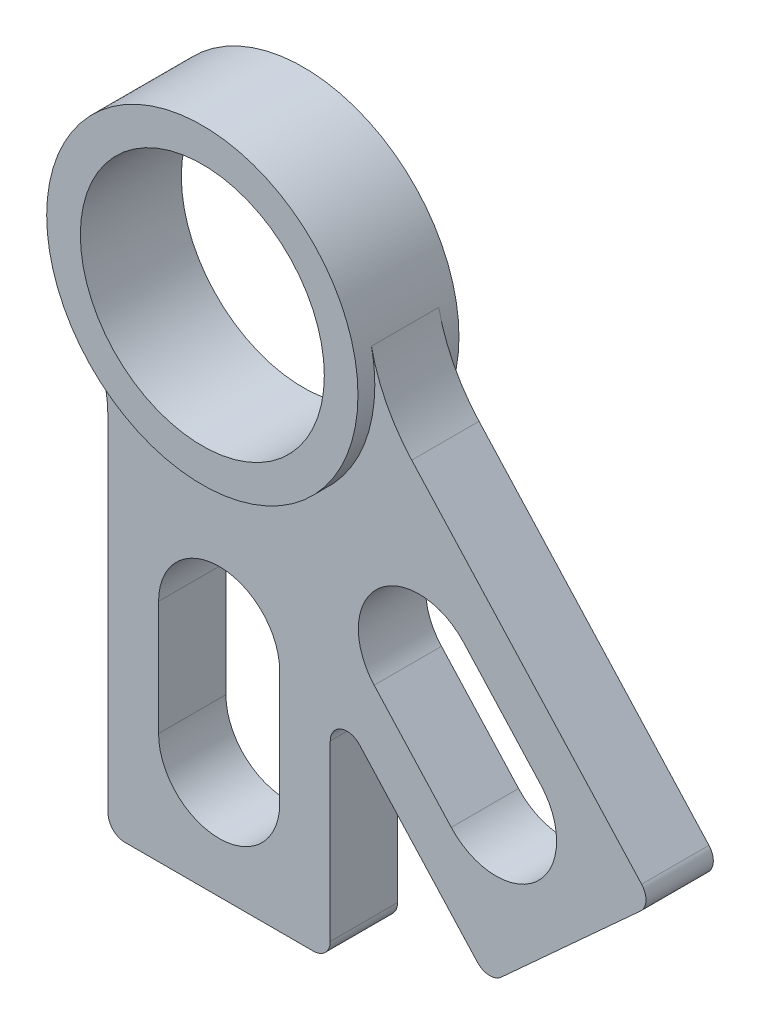
ISO-10303-21;
HEADER;
FILE_DESCRIPTION(('STEP AP214'),'2;1');
FILE_NAME('part.step','',(''),(''),'','','');
FILE_SCHEMA(('AUTOMOTIVE_DESIGN { 1 0 10303 214 1 1 1 1 }'));
ENDSEC;
DATA;
#1=APPLICATION_CONTEXT('core data for automotive mechanical design processes');
#2=APPLICATION_PROTOCOL_DEFINITION('international standard','automotive_design',2000,#1);
#3=PRODUCT_CONTEXT('',#1,'mechanical');
#4=PRODUCT('Part','Part','',(#3));
#5=PRODUCT_RELATED_PRODUCT_CATEGORY('part','',(#4));
#6=PRODUCT_DEFINITION_FORMATION('','',#4);
#7=PRODUCT_DEFINITION_CONTEXT('part definition',#1,'design');
#8=PRODUCT_DEFINITION('design','',#6,#7);
#9=PRODUCT_DEFINITION_SHAPE('','',#8);
#10=(LENGTH_UNIT() NAMED_UNIT(*) SI_UNIT(.MILLI.,.METRE.));
#11=(NAMED_UNIT(*) PLANE_ANGLE_UNIT() SI_UNIT($,.RADIAN.));
#12=(NAMED_UNIT(*) SI_UNIT($,.STERADIAN.) SOLID_ANGLE_UNIT());
#13=UNCERTAINTY_MEASURE_WITH_UNIT(LENGTH_MEASURE(1.E-05),#10,'distance_accuracy_value','');
#14=(GEOMETRIC_REPRESENTATION_CONTEXT(3) GLOBAL_UNCERTAINTY_ASSIGNED_CONTEXT((#13)) GLOBAL_UNIT_ASSIGNED_CONTEXT((#10,
#11,#12)) REPRESENTATION_CONTEXT('',''));
#15=CARTESIAN_POINT('',(0.,0.,0.));
#16=DIRECTION('',(0.,0.,1.));
#17=DIRECTION('',(1.,0.,0.));
#18=AXIS2_PLACEMENT_3D('',#15,#16,#17);
#19=CARTESIAN_POINT('',(0.,-27.8494680994688,4.7625));
#20=DIRECTION('',(0.,0.,-1.));
#21=DIRECTION('',(-1.,0.,0.));
#22=AXIS2_PLACEMENT_3D('',#19,#20,#21);
#23=CYLINDRICAL_SURFACE('',#22,5.71499999999999);
#24=CARTESIAN_POINT('',(0.,-27.8494680994688,-3.175));
#25=DIRECTION('',(0.,0.,1.));
#26=DIRECTION('',(1.,0.,0.));
#27=AXIS2_PLACEMENT_3D('',#24,#25,#26);
#28=CIRCLE('',#27,5.71500000000001);
#29=CARTESIAN_POINT('',(5.71500000000001,-27.8494680994688,-3.175));
#30=VERTEX_POINT('',#29);
#31=CARTESIAN_POINT('',(-5.71499999999999,-27.8494680994688,-3.175));
#32=VERTEX_POINT('',#31);
#33=EDGE_CURVE('E504',#30,#32,#28,.T.);
#34=ORIENTED_EDGE('',*,*,#33,.F.);
#35=DIRECTION('',(0.,0.,-1.));
#36=VECTOR('',#35,1.);
#37=CARTESIAN_POINT('',(5.71499999999999,-27.8494680994688,4.7625));
#38=LINE('',#37,#36);
#39=CARTESIAN_POINT('',(5.71500000000001,-27.8494680994688,3.175));
#40=VERTEX_POINT('',#39);
#41=EDGE_CURVE('E391',#40,#30,#38,.T.);
#42=ORIENTED_EDGE('',*,*,#41,.F.);
#43=CARTESIAN_POINT('',(0.,-27.8494680994688,3.175));
#44=DIRECTION('',(0.,0.,1.));
#45=DIRECTION('',(1.,0.,0.));
#46=AXIS2_PLACEMENT_3D('',#43,#44,#45);
#47=CIRCLE('',#46,5.71500000000001);
#48=CARTESIAN_POINT('',(-5.71500000000001,-27.8494680994688,3.175));
#49=VERTEX_POINT('',#48);
#50=EDGE_CURVE('E539',#40,#49,#47,.T.);
#51=ORIENTED_EDGE('',*,*,#50,.T.);
#52=DIRECTION('',(0.,0.,-1.));
#53=VECTOR('',#52,1.);
#54=CARTESIAN_POINT('',(-5.71499999999999,-27.8494680994688,4.7625));
#55=LINE('',#54,#53);
#56=EDGE_CURVE('E368',#49,#32,#55,.T.);
#57=ORIENTED_EDGE('',*,*,#56,.T.);
#58=EDGE_LOOP('',(#34,#42,#51,#57));
#59=FACE_BOUND('',#58,.T.);
#60=ADVANCED_FACE('F191',(#59),#23,.F.);
#61=CARTESIAN_POINT('',(5.71499999999995,0.,4.7625));
#62=DIRECTION('',(-1.,0.,0.));
#63=DIRECTION('',(0.,-1.,0.));
#64=AXIS2_PLACEMENT_3D('',#61,#62,#63);
#65=PLANE('',#64);
#66=DIRECTION('',(0.,1.,0.));
#67=VECTOR('',#66,1.);
#68=CARTESIAN_POINT('',(5.71500000000003,0.,-3.175));
#69=LINE('',#68,#67);
#70=CARTESIAN_POINT('',(5.715,-38.6444680994688,-3.175));
#71=VERTEX_POINT('',#70);
#72=EDGE_CURVE('E506',#71,#30,#69,.T.);
#73=ORIENTED_EDGE('',*,*,#72,.F.);
#74=DIRECTION('',(0.,0.,-1.));
#75=VECTOR('',#74,1.);
#76=CARTESIAN_POINT('',(5.715,-38.6444680994688,4.7625));
#77=LINE('',#76,#75);
#78=CARTESIAN_POINT('',(5.715,-38.6444680994688,3.175));
#79=VERTEX_POINT('',#78);
#80=EDGE_CURVE('E485',#79,#71,#77,.T.);
#81=ORIENTED_EDGE('',*,*,#80,.F.);
#82=DIRECTION('',(0.,-1.,0.));
#83=VECTOR('',#82,1.);
#84=CARTESIAN_POINT('',(5.71500000000003,0.,3.175));
#85=LINE('',#84,#83);
#86=EDGE_CURVE('E537',#40,#79,#85,.T.);
#87=ORIENTED_EDGE('',*,*,#86,.F.);
#88=ORIENTED_EDGE('',*,*,#41,.T.);
#89=EDGE_LOOP('',(#73,#81,#87,#88));
#90=FACE_BOUND('',#89,.T.);
#91=ADVANCED_FACE('F577',(#90),#65,.T.);
#92=CARTESIAN_POINT('',(0.,-38.6444680994688,4.7625));
#93=DIRECTION('',(0.,0.,-1.));
#94=DIRECTION('',(-1.,0.,0.));
#95=AXIS2_PLACEMENT_3D('',#92,#93,#94);
#96=CYLINDRICAL_SURFACE('',#95,5.715);
#97=CARTESIAN_POINT('',(0.,-38.6444680994688,-3.175));
#98=DIRECTION('',(0.,0.,1.));
#99=DIRECTION('',(1.,0.,0.));
#100=AXIS2_PLACEMENT_3D('',#97,#98,#99);
#101=CIRCLE('',#100,5.715);
#102=CARTESIAN_POINT('',(-5.71500000000001,-38.6444680994688,-3.175));
#103=VERTEX_POINT('',#102);
#104=EDGE_CURVE('E508',#103,#71,#101,.T.);
#105=ORIENTED_EDGE('',*,*,#104,.F.);
#106=DIRECTION('',(0.,0.,-1.));
#107=VECTOR('',#106,1.);
#108=CARTESIAN_POINT('',(-5.715,-38.6444680994688,4.7625));
#109=LINE('',#108,#107);
#110=CARTESIAN_POINT('',(-5.715,-38.6444680994688,3.175));
#111=VERTEX_POINT('',#110);
#112=EDGE_CURVE('E482',#111,#103,#109,.T.);
#113=ORIENTED_EDGE('',*,*,#112,.F.);
#114=CARTESIAN_POINT('',(0.,-38.6444680994688,3.175));
#115=DIRECTION('',(0.,0.,1.));
#116=DIRECTION('',(1.,0.,0.));
#117=AXIS2_PLACEMENT_3D('',#114,#115,#116);
#118=CIRCLE('',#117,5.715);
#119=EDGE_CURVE('E534',#111,#79,#118,.T.);
#120=ORIENTED_EDGE('',*,*,#119,.T.);
#121=ORIENTED_EDGE('',*,*,#80,.T.);
#122=EDGE_LOOP('',(#105,#113,#120,#121));
#123=FACE_BOUND('',#122,.T.);
#124=ADVANCED_FACE('F583',(#123),#96,.F.);
#125=CARTESIAN_POINT('',(18.8429544518519,-20.6791159106485,4.7625));
#126=DIRECTION('',(0.,0.,-1.));
#127=DIRECTION('',(-1.,0.,0.));
#128=AXIS2_PLACEMENT_3D('',#125,#126,#127);
#129=CYLINDRICAL_SURFACE('',#128,5.71500000000001);
#130=CARTESIAN_POINT('',(18.8429544518522,-20.6791159106487,-3.175));
#131=DIRECTION('',(0.,0.,1.));
#132=DIRECTION('',(1.,0.,0.));
#133=AXIS2_PLACEMENT_3D('',#130,#131,#132);
#134=CIRCLE('',#133,5.71500000000001);
#135=CARTESIAN_POINT('',(23.0672599291972,-16.8298993365816,-3.175));
#136=VERTEX_POINT('',#135);
#137=CARTESIAN_POINT('',(14.6186489745069,-24.5283324847155,-3.175));
#138=VERTEX_POINT('',#137);
#139=EDGE_CURVE('E361',#136,#138,#134,.T.);
#140=ORIENTED_EDGE('',*,*,#139,.F.);
#141=DIRECTION('',(0.,0.,-1.));
#142=VECTOR('',#141,1.);
#143=CARTESIAN_POINT('',(23.0672599291971,-16.8298993365813,4.7625));
#144=LINE('',#143,#142);
#145=CARTESIAN_POINT('',(23.0672599291972,-16.8298993365816,3.175));
#146=VERTEX_POINT('',#145);
#147=EDGE_CURVE('E360',#146,#136,#144,.T.);
#148=ORIENTED_EDGE('',*,*,#147,.F.);
#149=CARTESIAN_POINT('',(18.8429544518522,-20.6791159106487,3.175));
#150=DIRECTION('',(0.,0.,1.));
#151=DIRECTION('',(1.,0.,0.));
#152=AXIS2_PLACEMENT_3D('',#149,#150,#151);
#153=CIRCLE('',#152,5.71500000000001);
#154=CARTESIAN_POINT('',(14.6186489745071,-24.5283324847157,3.175));
#155=VERTEX_POINT('',#154);
#156=EDGE_CURVE('E494',#146,#155,#153,.T.);
#157=ORIENTED_EDGE('',*,*,#156,.T.);
#158=DIRECTION('',(0.,0.,-1.));
#159=VECTOR('',#158,1.);
#160=CARTESIAN_POINT('',(14.6186489745069,-24.5283324847155,4.7625));
#161=LINE('',#160,#159);
#162=EDGE_CURVE('E370',#155,#138,#161,.T.);
#163=ORIENTED_EDGE('',*,*,#162,.T.);
#164=EDGE_LOOP('',(#140,#148,#157,#163));
#165=FACE_BOUND('',#164,.T.);
#166=ADVANCED_FACE('F493',(#165),#129,.F.);
#167=CARTESIAN_POINT('',(4.22430547734509,3.84921657406708,4.7625));
#168=DIRECTION('',(-0.73916106340246,-0.673528709373063,0.));
#169=DIRECTION('',(0.673528709373063,-0.73916106340246,0.));
#170=AXIS2_PLACEMENT_3D('',#167,#168,#169);
#171=PLANE('',#170);
#172=DIRECTION('',(-0.673528709373063,0.73916106340246,0.));
#173=VECTOR('',#172,1.);
#174=CARTESIAN_POINT('',(4.22430547734507,3.84921657406706,-3.175));
#175=LINE('',#174,#173);
#176=CARTESIAN_POINT('',(30.3380023468795,-24.8091430160112,-3.175));
#177=VERTEX_POINT('',#176);
#178=EDGE_CURVE('E343',#177,#136,#175,.T.);
#179=ORIENTED_EDGE('',*,*,#178,.F.);
#180=DIRECTION('',(0.,0.,-1.));
#181=VECTOR('',#180,1.);
#182=CARTESIAN_POINT('',(30.3380023468793,-24.8091430160109,4.7625));
#183=LINE('',#182,#181);
#184=CARTESIAN_POINT('',(30.3380023468795,-24.8091430160112,3.175));
#185=VERTEX_POINT('',#184);
#186=EDGE_CURVE('E358',#185,#177,#183,.T.);
#187=ORIENTED_EDGE('',*,*,#186,.F.);
#188=DIRECTION('',(0.673528709373063,-0.73916106340246,0.));
#189=VECTOR('',#188,1.);
#190=CARTESIAN_POINT('',(4.22430547734507,3.84921657406706,3.175));
#191=LINE('',#190,#189);
#192=EDGE_CURVE('E530',#146,#185,#191,.T.);
#193=ORIENTED_EDGE('',*,*,#192,.F.);
#194=ORIENTED_EDGE('',*,*,#147,.T.);
#195=EDGE_LOOP('',(#179,#187,#193,#194));
#196=FACE_BOUND('',#195,.T.);
#197=ADVANCED_FACE('F356',(#196),#171,.T.);
#198=CARTESIAN_POINT('',(26.1136968695342,-28.658359590078,4.7625));
#199=DIRECTION('',(0.,0.,-1.));
#200=DIRECTION('',(-1.,0.,0.));
#201=AXIS2_PLACEMENT_3D('',#198,#199,#200);
#202=CYLINDRICAL_SURFACE('',#201,5.71500000000002);
#203=CARTESIAN_POINT('',(26.1136968695344,-28.6583595900782,-3.175));
#204=DIRECTION('',(0.,0.,1.));
#205=DIRECTION('',(1.,0.,0.));
#206=AXIS2_PLACEMENT_3D('',#203,#204,#205);
#207=CIRCLE('',#206,5.71500000000001);
#208=CARTESIAN_POINT('',(21.8893913921893,-32.5075761641453,-3.175));
#209=VERTEX_POINT('',#208);
#210=EDGE_CURVE('E339',#209,#177,#207,.T.);
#211=ORIENTED_EDGE('',*,*,#210,.F.);
#212=DIRECTION('',(0.,0.,-1.));
#213=VECTOR('',#212,1.);
#214=CARTESIAN_POINT('',(21.8893913921891,-32.5075761641451,4.7625));
#215=LINE('',#214,#213);
#216=CARTESIAN_POINT('',(21.8893913921891,-32.5075761641451,3.175));
#217=VERTEX_POINT('',#216);
#218=EDGE_CURVE('E366',#217,#209,#215,.T.);
#219=ORIENTED_EDGE('',*,*,#218,.F.);
#220=CARTESIAN_POINT('',(26.1136968695344,-28.6583595900782,3.175));
#221=DIRECTION('',(0.,0.,1.));
#222=DIRECTION('',(1.,0.,0.));
#223=AXIS2_PLACEMENT_3D('',#220,#221,#222);
#224=CIRCLE('',#223,5.71500000000001);
#225=EDGE_CURVE('E365',#217,#185,#224,.T.);
#226=ORIENTED_EDGE('',*,*,#225,.T.);
#227=ORIENTED_EDGE('',*,*,#186,.T.);
#228=EDGE_LOOP('',(#211,#219,#226,#227));
#229=FACE_BOUND('',#228,.T.);
#230=ADVANCED_FACE('F364',(#229),#202,.F.);
#231=CARTESIAN_POINT('',(29.8961889852618,6.31658472573722,4.7625));
#232=DIRECTION('',(0.,0.,-1.));
#233=DIRECTION('',(-1.,0.,0.));
#234=AXIS2_PLACEMENT_3D('',#231,#232,#233);
#235=CYLINDRICAL_SURFACE('',#234,15.8749999999984);
#236=DIRECTION('',(0.,0.,-1.));
#237=VECTOR('',#236,1.);
#238=CARTESIAN_POINT('',(18.1620071037492,-4.37568353555936,4.7625));
#239=LINE('',#238,#237);
#240=CARTESIAN_POINT('',(18.1620071037489,-4.37568353555901,3.175));
#241=VERTEX_POINT('',#240);
#242=CARTESIAN_POINT('',(18.1620071037488,-4.375683535559,-3.175));
#243=VERTEX_POINT('',#242);
#244=EDGE_CURVE('E374',#241,#243,#239,.T.);
#245=ORIENTED_EDGE('',*,*,#244,.T.);
#246=CARTESIAN_POINT('',(29.8961889852617,6.31658472573731,-3.175));
#247=DIRECTION('',(0.,0.,1.));
#248=DIRECTION('',(1.,0.,0.));
#249=AXIS2_PLACEMENT_3D('',#246,#247,#248);
#250=CIRCLE('',#249,15.8749999999984);
#251=CARTESIAN_POINT('',(14.3640874758788,3.03490105692132,-3.175));
#252=VERTEX_POINT('',#251);
#253=EDGE_CURVE('E512',#252,#243,#250,.T.);
#254=ORIENTED_EDGE('',*,*,#253,.F.);
#255=DIRECTION('',(0.,0.,-1.));
#256=VECTOR('',#255,1.);
#257=CARTESIAN_POINT('',(14.3640874758788,3.03490105692129,4.7625));
#258=LINE('',#257,#256);
#259=CARTESIAN_POINT('',(14.3640874758788,3.03490105692132,3.175));
#260=VERTEX_POINT('',#259);
#261=EDGE_CURVE('E384',#260,#252,#258,.T.);
#262=ORIENTED_EDGE('',*,*,#261,.F.);
#263=CARTESIAN_POINT('',(29.8961889852617,6.31658472573731,3.175));
#264=DIRECTION('',(0.,0.,1.));
#265=DIRECTION('',(1.,0.,0.));
#266=AXIS2_PLACEMENT_3D('',#263,#264,#265);
#267=CIRCLE('',#266,15.8749999999984);
#268=EDGE_CURVE('E466',#260,#241,#267,.T.);
#269=ORIENTED_EDGE('',*,*,#268,.T.);
#270=EDGE_LOOP('',(#245,#254,#262,#269));
#271=FACE_BOUND('',#270,.T.);
#272=ADVANCED_FACE('F594',(#271),#235,.F.);
#273=CARTESIAN_POINT('',(-26.3524999999984,-15.4669680994688,4.7625));
#274=DIRECTION('',(0.,0.,-1.));
#275=DIRECTION('',(-1.,0.,0.));
#276=AXIS2_PLACEMENT_3D('',#273,#274,#275);
#277=CYLINDRICAL_SURFACE('',#276,15.8749999999984);
#278=CARTESIAN_POINT('',(-26.3524999999984,-15.4669680994688,-3.175));
#279=DIRECTION('',(0.,0.,1.));
#280=DIRECTION('',(1.,0.,0.));
#281=AXIS2_PLACEMENT_3D('',#278,#279,#280);
#282=CIRCLE('',#281,15.8749999999984);
#283=CARTESIAN_POINT('',(-10.4775,-15.4669680994688,-3.175));
#284=VERTEX_POINT('',#283);
#285=CARTESIAN_POINT('',(-12.6614671654197,-7.43134460639522,-3.175));
#286=VERTEX_POINT('',#285);
#287=EDGE_CURVE('E517',#284,#286,#282,.T.);
#288=ORIENTED_EDGE('',*,*,#287,.F.);
#289=DIRECTION('',(0.,0.,-1.));
#290=VECTOR('',#289,1.);
#291=CARTESIAN_POINT('',(-10.4775,-15.4669680994688,4.7625));
#292=LINE('',#291,#290);
#293=CARTESIAN_POINT('',(-10.4775,-15.4669680994688,3.175));
#294=VERTEX_POINT('',#293);
#295=EDGE_CURVE('E377',#294,#284,#292,.T.);
#296=ORIENTED_EDGE('',*,*,#295,.F.);
#297=CARTESIAN_POINT('',(-26.3524999999984,-15.4669680994688,3.175));
#298=DIRECTION('',(0.,0.,1.));
#299=DIRECTION('',(1.,0.,0.));
#300=AXIS2_PLACEMENT_3D('',#297,#298,#299);
#301=CIRCLE('',#300,15.8749999999984);
#302=CARTESIAN_POINT('',(-12.6614671654197,-7.43134460639522,3.175));
#303=VERTEX_POINT('',#302);
#304=EDGE_CURVE('E461',#294,#303,#301,.T.);
#305=ORIENTED_EDGE('',*,*,#304,.T.);
#306=DIRECTION('',(0.,0.,-1.));
#307=VECTOR('',#306,1.);
#308=CARTESIAN_POINT('',(-12.6614671654197,-7.43134460639522,4.7625));
#309=LINE('',#308,#307);
#310=EDGE_CURVE('E381',#303,#286,#309,.T.);
#311=ORIENTED_EDGE('',*,*,#310,.T.);
#312=EDGE_LOOP('',(#288,#296,#305,#311));
#313=FACE_BOUND('',#312,.T.);
#314=ADVANCED_FACE('F615',(#313),#277,.F.);
#315=CARTESIAN_POINT('',(-10.4775,0.,4.7625));
#316=DIRECTION('',(1.,0.,0.));
#317=DIRECTION('',(0.,0.,-1.));
#318=AXIS2_PLACEMENT_3D('',#315,#316,#317);
#319=PLANE('',#318);
#320=DIRECTION('',(0.,-1.,0.));
#321=VECTOR('',#320,1.);
#322=CARTESIAN_POINT('',(-10.4775,0.,-3.175));
#323=LINE('',#322,#321);
#324=CARTESIAN_POINT('',(-10.4775,-47.5344680994688,-3.175));
#325=VERTEX_POINT('',#324);
#326=EDGE_CURVE('E520',#284,#325,#323,.T.);
#327=ORIENTED_EDGE('',*,*,#326,.T.);
#328=DIRECTION('',(0.,0.,-1.));
#329=VECTOR('',#328,1.);
#330=CARTESIAN_POINT('',(-10.4775,-47.5344680994688,4.7625));
#331=LINE('',#330,#329);
#332=CARTESIAN_POINT('',(-10.4775,-47.5344680994688,3.175));
#333=VERTEX_POINT('',#332);
#334=EDGE_CURVE('E426',#325,#333,#331,.F.);
#335=ORIENTED_EDGE('',*,*,#334,.T.);
#336=DIRECTION('',(0.,1.,0.));
#337=VECTOR('',#336,1.);
#338=CARTESIAN_POINT('',(-10.4775,0.,3.175));
#339=LINE('',#338,#337);
#340=EDGE_CURVE('E459',#333,#294,#339,.T.);
#341=ORIENTED_EDGE('',*,*,#340,.T.);
#342=ORIENTED_EDGE('',*,*,#295,.T.);
#343=EDGE_LOOP('',(#327,#335,#341,#342));
#344=FACE_BOUND('',#343,.T.);
#345=ADVANCED_FACE('F611',(#344),#319,.F.);
#346=CARTESIAN_POINT('',(0.,-49.1219680994688,4.7625));
#347=DIRECTION('',(0.,1.,0.));
#348=DIRECTION('',(-1.,0.,0.));
#349=AXIS2_PLACEMENT_3D('',#346,#347,#348);
#350=PLANE('',#349);
#351=DIRECTION('',(1.,0.,0.));
#352=VECTOR('',#351,1.);
#353=CARTESIAN_POINT('',(0.,-49.1219680994688,-3.175));
#354=LINE('',#353,#352);
#355=CARTESIAN_POINT('',(-8.89,-49.1219680994688,-3.175));
#356=VERTEX_POINT('',#355);
#357=CARTESIAN_POINT('',(8.89,-49.1219680994688,-3.175));
#358=VERTEX_POINT('',#357);
#359=EDGE_CURVE('E441',#356,#358,#354,.T.);
#360=ORIENTED_EDGE('',*,*,#359,.T.);
#361=DIRECTION('',(0.,0.,-1.));
#362=VECTOR('',#361,1.);
#363=CARTESIAN_POINT('',(8.89,-49.1219680994688,3.175));
#364=LINE('',#363,#362);
#365=CARTESIAN_POINT('',(8.89,-49.1219680994688,3.175));
#366=VERTEX_POINT('',#365);
#367=EDGE_CURVE('E424',#358,#366,#364,.F.);
#368=ORIENTED_EDGE('',*,*,#367,.T.);
#369=DIRECTION('',(-1.,0.,0.));
#370=VECTOR('',#369,1.);
#371=CARTESIAN_POINT('',(0.,-49.1219680994688,3.175));
#372=LINE('',#371,#370);
#373=CARTESIAN_POINT('',(-8.89,-49.1219680994688,3.175));
#374=VERTEX_POINT('',#373);
#375=EDGE_CURVE('E450',#366,#374,#372,.T.);
#376=ORIENTED_EDGE('',*,*,#375,.T.);
#377=DIRECTION('',(0.,0.,-1.));
#378=VECTOR('',#377,1.);
#379=CARTESIAN_POINT('',(-8.89,-49.1219680994688,4.7625));
#380=LINE('',#379,#378);
#381=EDGE_CURVE('E421',#374,#356,#380,.T.);
#382=ORIENTED_EDGE('',*,*,#381,.T.);
#383=EDGE_LOOP('',(#360,#368,#376,#382));
#384=FACE_BOUND('',#383,.T.);
#385=ADVANCED_FACE('F608',(#384),#350,.F.);
#386=CARTESIAN_POINT('',(10.4775,0.,4.7625));
#387=DIRECTION('',(1.,0.,0.));
#388=DIRECTION('',(0.,1.,0.));
#389=AXIS2_PLACEMENT_3D('',#386,#387,#388);
#390=PLANE('',#389);
#391=DIRECTION('',(0.,-1.,0.));
#392=VECTOR('',#391,1.);
#393=CARTESIAN_POINT('',(10.4775,0.,-3.175));
#394=LINE('',#393,#392);
#395=CARTESIAN_POINT('',(10.4775,-31.1537992931023,-3.175));
#396=VERTEX_POINT('',#395);
#397=CARTESIAN_POINT('',(10.4775,-47.5344680994688,-3.175));
#398=VERTEX_POINT('',#397);
#399=EDGE_CURVE('E432',#396,#398,#394,.T.);
#400=ORIENTED_EDGE('',*,*,#399,.F.);
#401=DIRECTION('',(0.,0.,-1.));
#402=VECTOR('',#401,1.);
#403=CARTESIAN_POINT('',(10.4775,-31.1537992931023,3.175));
#404=LINE('',#403,#402);
#405=CARTESIAN_POINT('',(10.4775,-31.1537992931023,3.175));
#406=VERTEX_POINT('',#405);
#407=EDGE_CURVE('E419',#396,#406,#404,.F.);
#408=ORIENTED_EDGE('',*,*,#407,.T.);
#409=DIRECTION('',(0.,1.,0.));
#410=VECTOR('',#409,1.);
#411=CARTESIAN_POINT('',(10.4775,0.,3.175));
#412=LINE('',#411,#410);
#413=CARTESIAN_POINT('',(10.4775,-47.5344680994688,3.175));
#414=VERTEX_POINT('',#413);
#415=EDGE_CURVE('E447',#414,#406,#412,.T.);
#416=ORIENTED_EDGE('',*,*,#415,.F.);
#417=DIRECTION('',(0.,0.,-1.));
#418=VECTOR('',#417,1.);
#419=CARTESIAN_POINT('',(10.4775,-47.5344680994688,-3.175));
#420=LINE('',#419,#418);
#421=EDGE_CURVE('E416',#414,#398,#420,.T.);
#422=ORIENTED_EDGE('',*,*,#421,.T.);
#423=EDGE_LOOP('',(#400,#408,#416,#422));
#424=FACE_BOUND('',#423,.T.);
#425=ADVANCED_FACE('F438',(#424),#390,.T.);
#426=CARTESIAN_POINT('',(-7.74456004179922,-7.05689705245619,4.7625));
#427=DIRECTION('',(-0.739161063402461,-0.673528709373062,0.));
#428=DIRECTION('',(0.673528709373062,-0.739161063402461,0.));
#429=AXIS2_PLACEMENT_3D('',#426,#427,#428);
#430=PLANE('',#429);
#431=DIRECTION('',(-0.673528709373064,0.73916106340246,0.));
#432=VECTOR('',#431,1.);
#433=CARTESIAN_POINT('',(-7.74456004179929,-7.05689705245629,-3.175));
#434=LINE('',#433,#432);
#435=CARTESIAN_POINT('',(24.3568070540614,-42.2863984961821,-3.175));
#436=VERTEX_POINT('',#435);
#437=CARTESIAN_POINT('',(13.2384181881514,-30.0845724669726,-3.175));
#438=VERTEX_POINT('',#437);
#439=EDGE_CURVE('E433',#436,#438,#434,.T.);
#440=ORIENTED_EDGE('',*,*,#439,.F.);
#441=DIRECTION('',(0.,0.,-1.));
#442=VECTOR('',#441,1.);
#443=CARTESIAN_POINT('',(24.3568070540614,-42.2863984961821,3.175));
#444=LINE('',#443,#442);
#445=CARTESIAN_POINT('',(24.3568070540614,-42.2863984961821,3.175));
#446=VERTEX_POINT('',#445);
#447=EDGE_CURVE('E206',#436,#446,#444,.F.);
#448=ORIENTED_EDGE('',*,*,#447,.T.);
#449=DIRECTION('',(0.673528709373064,-0.73916106340246,0.));
#450=VECTOR('',#449,1.);
#451=CARTESIAN_POINT('',(-7.74456004179929,-7.05689705245629,3.175));
#452=LINE('',#451,#450);
#453=CARTESIAN_POINT('',(13.2384181881514,-30.0845724669726,3.175));
#454=VERTEX_POINT('',#453);
#455=EDGE_CURVE('E445',#454,#446,#452,.T.);
#456=ORIENTED_EDGE('',*,*,#455,.F.);
#457=DIRECTION('',(0.,0.,-1.));
#458=VECTOR('',#457,1.);
#459=CARTESIAN_POINT('',(13.2384181881514,-30.0845724669726,-3.175));
#460=LINE('',#459,#458);
#461=EDGE_CURVE('E412',#454,#438,#460,.T.);
#462=ORIENTED_EDGE('',*,*,#461,.T.);
#463=EDGE_LOOP('',(#440,#448,#456,#462));
#464=FACE_BOUND('',#463,.T.);
#465=ADVANCED_FACE('F444',(#464),#430,.T.);
#466=CARTESIAN_POINT('',(33.1705939219905,-36.4029196318772,4.7625));
#467=DIRECTION('',(-0.673528709373065,0.739161063402459,0.));
#468=DIRECTION('',(-0.739161063402459,-0.673528709373065,0.));
#469=AXIS2_PLACEMENT_3D('',#466,#467,#468);
#470=PLANE('',#469);
#471=DIRECTION('',(0.739161063402461,0.673528709373063,0.));
#472=VECTOR('',#471,1.);
#473=CARTESIAN_POINT('',(33.1705939219906,-36.4029196318775,-3.175));
#474=LINE('',#473,#472);
#475=CARTESIAN_POINT('',(26.5994520683428,-42.390589858204,-3.175));
#476=VERTEX_POINT('',#475);
#477=CARTESIAN_POINT('',(39.7417357756385,-30.415249405551,-3.175));
#478=VERTEX_POINT('',#477);
#479=EDGE_CURVE('E526',#476,#478,#474,.T.);
#480=ORIENTED_EDGE('',*,*,#479,.T.);
#481=DIRECTION('',(0.,0.,-1.));
#482=VECTOR('',#481,1.);
#483=CARTESIAN_POINT('',(39.7417357756383,-30.4152494055507,4.7625));
#484=LINE('',#483,#482);
#485=CARTESIAN_POINT('',(39.7417357756385,-30.415249405551,3.175));
#486=VERTEX_POINT('',#485);
#487=EDGE_CURVE('E402',#478,#486,#484,.F.);
#488=ORIENTED_EDGE('',*,*,#487,.T.);
#489=DIRECTION('',(-0.739161063402461,-0.673528709373063,0.));
#490=VECTOR('',#489,1.);
#491=CARTESIAN_POINT('',(33.1705939219906,-36.4029196318775,3.175));
#492=LINE('',#491,#490);
#493=CARTESIAN_POINT('',(26.5994520683428,-42.390589858204,3.175));
#494=VERTEX_POINT('',#493);
#495=EDGE_CURVE('E448',#486,#494,#492,.T.);
#496=ORIENTED_EDGE('',*,*,#495,.T.);
#497=DIRECTION('',(0.,0.,-1.));
#498=VECTOR('',#497,1.);
#499=CARTESIAN_POINT('',(26.5994520683426,-42.3905898582038,-3.175));
#500=LINE('',#499,#498);
#501=EDGE_CURVE('E399',#494,#476,#500,.T.);
#502=ORIENTED_EDGE('',*,*,#501,.T.);
#503=EDGE_LOOP('',(#480,#488,#496,#502));
#504=FACE_BOUND('',#503,.T.);
#505=ADVANCED_FACE('F556',(#504),#470,.F.);
#506=CARTESIAN_POINT('',(-5.71499999999995,0.,4.7625));
#507=DIRECTION('',(-1.,0.,0.));
#508=DIRECTION('',(0.,-1.,0.));
#509=AXIS2_PLACEMENT_3D('',#506,#507,#508);
#510=PLANE('',#509);
#511=ORIENTED_EDGE('',*,*,#112,.T.);
#512=DIRECTION('',(0.,1.,0.));
#513=VECTOR('',#512,1.);
#514=CARTESIAN_POINT('',(-5.71500000000003,0.,-3.175));
#515=LINE('',#514,#513);
#516=EDGE_CURVE('E351',#103,#32,#515,.T.);
#517=ORIENTED_EDGE('',*,*,#516,.T.);
#518=ORIENTED_EDGE('',*,*,#56,.F.);
#519=DIRECTION('',(0.,-1.,0.));
#520=VECTOR('',#519,1.);
#521=CARTESIAN_POINT('',(-5.71500000000003,0.,3.175));
#522=LINE('',#521,#520);
#523=EDGE_CURVE('E542',#49,#111,#522,.T.);
#524=ORIENTED_EDGE('',*,*,#523,.T.);
#525=EDGE_LOOP('',(#511,#517,#518,#524));
#526=FACE_BOUND('',#525,.T.);
#527=ADVANCED_FACE('F591',(#526),#510,.F.);
#528=CARTESIAN_POINT('',(-4.22430547734502,-3.84921657406701,4.7625));
#529=DIRECTION('',(-0.739161063402461,-0.673528709373062,0.));
#530=DIRECTION('',(0.673528709373062,-0.739161063402461,0.));
#531=AXIS2_PLACEMENT_3D('',#528,#529,#530);
#532=PLANE('',#531);
#533=ORIENTED_EDGE('',*,*,#218,.T.);
#534=DIRECTION('',(-0.673528709373064,0.73916106340246,0.));
#535=VECTOR('',#534,1.);
#536=CARTESIAN_POINT('',(-4.22430547734507,-3.84921657406707,-3.175));
#537=LINE('',#536,#535);
#538=EDGE_CURVE('E346',#209,#138,#537,.T.);
#539=ORIENTED_EDGE('',*,*,#538,.T.);
#540=ORIENTED_EDGE('',*,*,#162,.F.);
#541=DIRECTION('',(0.673528709373064,-0.73916106340246,0.));
#542=VECTOR('',#541,1.);
#543=CARTESIAN_POINT('',(-4.22430547734507,-3.84921657406707,3.175));
#544=LINE('',#543,#542);
#545=EDGE_CURVE('E498',#155,#217,#544,.T.);
#546=ORIENTED_EDGE('',*,*,#545,.T.);
#547=EDGE_LOOP('',(#533,#539,#540,#546));
#548=FACE_BOUND('',#547,.T.);
#549=ADVANCED_FACE('F497',(#548),#532,.F.);
#550=CARTESIAN_POINT('',(7.74456004179932,7.0568970524563,4.7625));
#551=DIRECTION('',(-0.739161063402461,-0.673528709373062,0.));
#552=DIRECTION('',(0.673528709373062,-0.739161063402461,0.));
#553=AXIS2_PLACEMENT_3D('',#550,#551,#552);
#554=PLANE('',#553);
#555=DIRECTION('',(0.673528709373063,-0.739161063402461,0.));
#556=VECTOR('',#555,1.);
#557=CARTESIAN_POINT('',(7.7445600417993,7.05689705245628,3.175));
#558=LINE('',#557,#556);
#559=CARTESIAN_POINT('',(39.84592713766,-28.1726043912696,3.175));
#560=VERTEX_POINT('',#559);
#561=EDGE_CURVE('E453',#241,#560,#558,.T.);
#562=ORIENTED_EDGE('',*,*,#561,.T.);
#563=DIRECTION('',(0.,0.,-1.));
#564=VECTOR('',#563,1.);
#565=CARTESIAN_POINT('',(39.84592713766,-28.1726043912696,4.7625));
#566=LINE('',#565,#564);
#567=CARTESIAN_POINT('',(39.84592713766,-28.1726043912696,-3.175));
#568=VERTEX_POINT('',#567);
#569=EDGE_CURVE('E387',#560,#568,#566,.T.);
#570=ORIENTED_EDGE('',*,*,#569,.T.);
#571=DIRECTION('',(-0.673528709373063,0.739161063402461,0.));
#572=VECTOR('',#571,1.);
#573=CARTESIAN_POINT('',(7.7445600417993,7.05689705245628,-3.175));
#574=LINE('',#573,#572);
#575=EDGE_CURVE('E510',#568,#243,#574,.T.);
#576=ORIENTED_EDGE('',*,*,#575,.T.);
#577=ORIENTED_EDGE('',*,*,#244,.F.);
#578=EDGE_LOOP('',(#562,#570,#576,#577));
#579=FACE_BOUND('',#578,.T.);
#580=ADVANCED_FACE('F548',(#579),#554,.F.);
#581=CARTESIAN_POINT('',(0.,0.,4.7625));
#582=DIRECTION('',(0.,0.,1.));
#583=DIRECTION('',(1.,0.,0.));
#584=AXIS2_PLACEMENT_3D('',#581,#582,#583);
#585=PLANE('',#584);
#586=CARTESIAN_POINT('',(0.,0.,4.7625));
#587=DIRECTION('',(0.,0.,1.));
#588=DIRECTION('',(1.,0.,0.));
#589=AXIS2_PLACEMENT_3D('',#586,#587,#588);
#590=CIRCLE('',#589,11.5062);
#591=CARTESIAN_POINT('',(-11.5062,0.,4.7625));
#592=VERTEX_POINT('',#591);
#593=EDGE_CURVE('E378',#592,#592,#590,.T.);
#594=ORIENTED_EDGE('',*,*,#593,.F.);
#595=EDGE_LOOP('',(#594));
#596=FACE_BOUND('',#595,.T.);
#597=CARTESIAN_POINT('',(0.,0.,4.7625));
#598=DIRECTION('',(0.,0.,1.));
#599=DIRECTION('',(1.,0.,0.));
#600=AXIS2_PLACEMENT_3D('',#597,#598,#599);
#601=CIRCLE('',#600,14.6812);
#602=CARTESIAN_POINT('',(14.6812,0.,4.7625));
#603=VERTEX_POINT('',#602);
#604=EDGE_CURVE('E470',#603,#603,#601,.T.);
#605=ORIENTED_EDGE('',*,*,#604,.T.);
#606=EDGE_LOOP('',(#605));
#607=FACE_BOUND('',#606,.T.);
#608=ADVANCED_FACE('F601',(#596,#607),#585,.T.);
#609=CARTESIAN_POINT('',(0.,0.,4.7625));
#610=DIRECTION('',(0.,0.,-1.));
#611=DIRECTION('',(-1.,0.,0.));
#612=AXIS2_PLACEMENT_3D('',#609,#610,#611);
#613=CYLINDRICAL_SURFACE('',#612,14.6812);
#614=CARTESIAN_POINT('',(0.,0.,-4.7625));
#615=DIRECTION('',(0.,0.,1.));
#616=DIRECTION('',(1.,0.,0.));
#617=AXIS2_PLACEMENT_3D('',#614,#615,#616);
#618=CIRCLE('',#617,14.6812);
#619=CARTESIAN_POINT('',(14.6812,0.,-4.7625));
#620=VERTEX_POINT('',#619);
#621=EDGE_CURVE('E469',#620,#620,#618,.T.);
#622=ORIENTED_EDGE('',*,*,#621,.T.);
#623=EDGE_LOOP('',(#622));
#624=FACE_BOUND('',#623,.T.);
#625=CARTESIAN_POINT('',(0.,0.,3.175));
#626=DIRECTION('',(0.,0.,1.));
#627=DIRECTION('',(1.,0.,0.));
#628=AXIS2_PLACEMENT_3D('',#625,#626,#627);
#629=CIRCLE('',#628,14.6812);
#630=EDGE_CURVE('E464',#303,#260,#629,.T.);
#631=ORIENTED_EDGE('',*,*,#630,.T.);
#632=ORIENTED_EDGE('',*,*,#261,.T.);
#633=CARTESIAN_POINT('',(0.,0.,-3.175));
#634=DIRECTION('',(0.,0.,1.));
#635=DIRECTION('',(1.,0.,0.));
#636=AXIS2_PLACEMENT_3D('',#633,#634,#635);
#637=CIRCLE('',#636,14.6812);
#638=EDGE_CURVE('E515',#286,#252,#637,.T.);
#639=ORIENTED_EDGE('',*,*,#638,.F.);
#640=ORIENTED_EDGE('',*,*,#310,.F.);
#641=EDGE_LOOP('',(#631,#632,#639,#640));
#642=FACE_BOUND('',#641,.T.);
#643=ORIENTED_EDGE('',*,*,#604,.F.);
#644=EDGE_LOOP('',(#643));
#645=FACE_BOUND('',#644,.T.);
#646=ADVANCED_FACE('F620',(#624,#642,#645),#613,.T.);
#647=CARTESIAN_POINT('',(0.,0.,4.7625));
#648=DIRECTION('',(0.,0.,-1.));
#649=DIRECTION('',(-1.,0.,0.));
#650=AXIS2_PLACEMENT_3D('',#647,#648,#649);
#651=CYLINDRICAL_SURFACE('',#650,11.5062);
#652=CARTESIAN_POINT('',(0.,0.,-4.7625));
#653=DIRECTION('',(0.,0.,1.));
#654=DIRECTION('',(1.,0.,0.));
#655=AXIS2_PLACEMENT_3D('',#652,#653,#654);
#656=CIRCLE('',#655,11.5062);
#657=CARTESIAN_POINT('',(-11.5062,0.,-4.7625));
#658=VERTEX_POINT('',#657);
#659=EDGE_CURVE('E473',#658,#658,#656,.T.);
#660=CARTESIAN_POINT('',(-11.5062,0.,4.7625));
#661=CARTESIAN_POINT('',(-11.5062,0.,4.66328125));
#662=CARTESIAN_POINT('',(-11.5062,0.,4.5640625));
#663=CARTESIAN_POINT('',(-11.5062,0.,4.365625));
#664=CARTESIAN_POINT('',(-11.5062,0.,4.26640625));
#665=CARTESIAN_POINT('',(-11.5062,0.,4.06796875));
#666=CARTESIAN_POINT('',(-11.5062,0.,3.96875));
#667=CARTESIAN_POINT('',(-11.5062,0.,3.7703125));
#668=CARTESIAN_POINT('',(-11.5062,0.,3.67109375));
#669=CARTESIAN_POINT('',(-11.5062,0.,3.47265625));
#670=CARTESIAN_POINT('',(-11.5062,0.,3.3734375));
#671=CARTESIAN_POINT('',(-11.5062,0.,3.175));
#672=CARTESIAN_POINT('',(-11.5062,0.,3.07578125));
#673=CARTESIAN_POINT('',(-11.5062,0.,2.87734375));
#674=CARTESIAN_POINT('',(-11.5062,0.,2.778125));
#675=CARTESIAN_POINT('',(-11.5062,0.,2.5796875));
#676=CARTESIAN_POINT('',(-11.5062,0.,2.48046875));
#677=CARTESIAN_POINT('',(-11.5062,0.,2.28203125));
#678=CARTESIAN_POINT('',(-11.5062,0.,2.1828125));
#679=CARTESIAN_POINT('',(-11.5062,0.,1.984375));
#680=CARTESIAN_POINT('',(-11.5062,0.,1.88515625));
#681=CARTESIAN_POINT('',(-11.5062,0.,1.68671875));
#682=CARTESIAN_POINT('',(-11.5062,0.,1.5875));
#683=CARTESIAN_POINT('',(-11.5062,0.,1.3890625));
#684=CARTESIAN_POINT('',(-11.5062,0.,1.28984375));
#685=CARTESIAN_POINT('',(-11.5062,0.,1.09140625));
#686=CARTESIAN_POINT('',(-11.5062,0.,0.992187499999999));
#687=CARTESIAN_POINT('',(-11.5062,0.,0.79375));
#688=CARTESIAN_POINT('',(-11.5062,0.,0.69453125));
#689=CARTESIAN_POINT('',(-11.5062,0.,0.49609375));
#690=CARTESIAN_POINT('',(-11.5062,0.,0.396875));
#691=CARTESIAN_POINT('',(-11.5062,0.,0.1984375));
#692=CARTESIAN_POINT('',(-11.5062,0.,0.0992187500000001));
#693=CARTESIAN_POINT('',(-11.5062,0.,-0.0992187500000001));
#694=CARTESIAN_POINT('',(-11.5062,0.,-0.1984375));
#695=CARTESIAN_POINT('',(-11.5062,0.,-0.396875));
#696=CARTESIAN_POINT('',(-11.5062,0.,-0.49609375));
#697=CARTESIAN_POINT('',(-11.5062,0.,-0.69453125));
#698=CARTESIAN_POINT('',(-11.5062,0.,-0.793750000000001));
#699=CARTESIAN_POINT('',(-11.5062,0.,-0.992187500000001));
#700=CARTESIAN_POINT('',(-11.5062,0.,-1.09140625));
#701=CARTESIAN_POINT('',(-11.5062,0.,-1.28984375));
#702=CARTESIAN_POINT('',(-11.5062,0.,-1.3890625));
#703=CARTESIAN_POINT('',(-11.5062,0.,-1.5875));
#704=CARTESIAN_POINT('',(-11.5062,0.,-1.68671875));
#705=CARTESIAN_POINT('',(-11.5062,0.,-1.88515625));
#706=CARTESIAN_POINT('',(-11.5062,0.,-1.984375));
#707=CARTESIAN_POINT('',(-11.5062,0.,-2.1828125));
#708=CARTESIAN_POINT('',(-11.5062,0.,-2.28203125));
#709=CARTESIAN_POINT('',(-11.5062,0.,-2.48046875));
#710=CARTESIAN_POINT('',(-11.5062,0.,-2.5796875));
#711=CARTESIAN_POINT('',(-11.5062,0.,-2.778125));
#712=CARTESIAN_POINT('',(-11.5062,0.,-2.87734375));
#713=CARTESIAN_POINT('',(-11.5062,0.,-3.07578125));
#714=CARTESIAN_POINT('',(-11.5062,0.,-3.175));
#715=CARTESIAN_POINT('',(-11.5062,0.,-3.3734375));
#716=CARTESIAN_POINT('',(-11.5062,0.,-3.47265625));
#717=CARTESIAN_POINT('',(-11.5062,0.,-3.67109375));
#718=CARTESIAN_POINT('',(-11.5062,0.,-3.7703125));
#719=CARTESIAN_POINT('',(-11.5062,0.,-3.96875));
#720=CARTESIAN_POINT('',(-11.5062,0.,-4.06796875));
#721=CARTESIAN_POINT('',(-11.5062,0.,-4.26640625));
#722=CARTESIAN_POINT('',(-11.5062,0.,-4.365625));
#723=CARTESIAN_POINT('',(-11.5062,0.,-4.5640625));
#724=CARTESIAN_POINT('',(-11.5062,0.,-4.66328125));
#725=CARTESIAN_POINT('',(-11.5062,0.,-4.7625));
#726=B_SPLINE_CURVE_WITH_KNOTS('',3,(#660,#661,#662,#663,#664,#665,#666,#667,#668,#669,#670,
#671,#672,#673,#674,#675,#676,#677,#678,#679,#680,#681,#682,#683,#684,#685,#686,#687,#688,#689,
#690,#691,#692,#693,#694,#695,#696,#697,#698,#699,#700,#701,#702,#703,#704,#705,#706,#707,#708,
#709,#710,#711,#712,#713,#714,#715,#716,#717,#718,#719,#720,#721,#722,#723,#724,#725),
.UNSPECIFIED.,.F.,.F.,(4,2,2,2,2,2,2,2,2,2,2,2,2,2,2,2,2,2,2,2,2,2,2,2,2,2,2,2,2,2,2,2,4),(0.,
0.29765625,0.5953125,0.892968750000001,1.190625,1.48828125,1.7859375,2.08359375,2.38125,
2.67890625,2.9765625,3.27421875,3.571875,3.86953125,4.1671875,4.46484375,4.7625,5.06015625,
5.3578125,5.65546875,5.953125,6.25078125,6.5484375,6.84609375,7.14375,7.44140625,7.7390625,
8.03671875,8.334375,8.63203125,8.9296875,9.22734375,9.525),.UNSPECIFIED.);
#727=EDGE_CURVE('BSEAM571',#592,#658,#726,.T.);
#728=ORIENTED_EDGE('',*,*,#593,.T.);
#729=ORIENTED_EDGE('',*,*,#659,.F.);
#730=ORIENTED_EDGE('',*,*,#727,.T.);
#731=ORIENTED_EDGE('',*,*,#727,.F.);
#732=EDGE_LOOP('',(#728,#730,#729,#731));
#733=FACE_BOUND('',#732,.T.);
#734=ADVANCED_FACE('F571',(#733),#651,.F.);
#735=CARTESIAN_POINT('',(0.,0.,-4.7625));
#736=DIRECTION('',(0.,0.,1.));
#737=DIRECTION('',(1.,0.,0.));
#738=AXIS2_PLACEMENT_3D('',#735,#736,#737);
#739=PLANE('',#738);
#740=ORIENTED_EDGE('',*,*,#621,.F.);
#741=EDGE_LOOP('',(#740));
#742=FACE_BOUND('',#741,.T.);
#743=ORIENTED_EDGE('',*,*,#659,.T.);
#744=EDGE_LOOP('',(#743));
#745=FACE_BOUND('',#744,.T.);
#746=ADVANCED_FACE('F563',(#742,#745),#739,.F.);
#747=CARTESIAN_POINT('',(-26.3524999999984,-15.4669680994688,3.175));
#748=DIRECTION('',(0.,0.,1.));
#749=DIRECTION('',(1.,0.,0.));
#750=AXIS2_PLACEMENT_3D('',#747,#748,#749);
#751=PLANE('',#750);
#752=ORIENTED_EDGE('',*,*,#545,.F.);
#753=ORIENTED_EDGE('',*,*,#156,.F.);
#754=ORIENTED_EDGE('',*,*,#192,.T.);
#755=ORIENTED_EDGE('',*,*,#225,.F.);
#756=EDGE_LOOP('',(#752,#753,#754,#755));
#757=FACE_BOUND('',#756,.T.);
#758=ORIENTED_EDGE('',*,*,#523,.F.);
#759=ORIENTED_EDGE('',*,*,#50,.F.);
#760=ORIENTED_EDGE('',*,*,#86,.T.);
#761=ORIENTED_EDGE('',*,*,#119,.F.);
#762=EDGE_LOOP('',(#758,#759,#760,#761));
#763=FACE_BOUND('',#762,.T.);
#764=ORIENTED_EDGE('',*,*,#495,.F.);
#765=CARTESIAN_POINT('',(38.6725089495086,-29.2418312173993,3.175));
#766=DIRECTION('',(0.,0.,1.));
#767=DIRECTION('',(1.,0.,0.));
#768=AXIS2_PLACEMENT_3D('',#765,#766,#767);
#769=CIRCLE('',#768,1.5875);
#770=EDGE_CURVE('E410',#486,#560,#769,.T.);
#771=ORIENTED_EDGE('',*,*,#770,.T.);
#772=ORIENTED_EDGE('',*,*,#561,.F.);
#773=ORIENTED_EDGE('',*,*,#268,.F.);
#774=ORIENTED_EDGE('',*,*,#630,.F.);
#775=ORIENTED_EDGE('',*,*,#304,.F.);
#776=ORIENTED_EDGE('',*,*,#340,.F.);
#777=CARTESIAN_POINT('',(-8.89,-47.5344680994688,3.175));
#778=DIRECTION('',(0.,0.,1.));
#779=DIRECTION('',(1.,0.,0.));
#780=AXIS2_PLACEMENT_3D('',#777,#778,#779);
#781=CIRCLE('',#780,1.5875);
#782=EDGE_CURVE('E404',#333,#374,#781,.T.);
#783=ORIENTED_EDGE('',*,*,#782,.T.);
#784=ORIENTED_EDGE('',*,*,#375,.F.);
#785=CARTESIAN_POINT('',(8.89,-47.5344680994688,3.175));
#786=DIRECTION('',(0.,0.,1.));
#787=DIRECTION('',(1.,0.,0.));
#788=AXIS2_PLACEMENT_3D('',#785,#786,#787);
#789=CIRCLE('',#788,1.5875);
#790=EDGE_CURVE('E406',#366,#414,#789,.T.);
#791=ORIENTED_EDGE('',*,*,#790,.T.);
#792=ORIENTED_EDGE('',*,*,#415,.T.);
#793=CARTESIAN_POINT('',(12.065,-31.1537992931023,3.175));
#794=DIRECTION('',(0.,0.,1.));
#795=DIRECTION('',(1.,0.,0.));
#796=AXIS2_PLACEMENT_3D('',#793,#794,#795);
#797=CIRCLE('',#796,1.5875);
#798=EDGE_CURVE('E12',#406,#454,#797,.F.);
#799=ORIENTED_EDGE('',*,*,#798,.T.);
#800=ORIENTED_EDGE('',*,*,#455,.T.);
#801=CARTESIAN_POINT('',(25.5302252422129,-41.2171716700524,3.175));
#802=DIRECTION('',(0.,0.,1.));
#803=DIRECTION('',(1.,0.,0.));
#804=AXIS2_PLACEMENT_3D('',#801,#802,#803);
#805=CIRCLE('',#804,1.5875);
#806=EDGE_CURVE('E408',#446,#494,#805,.T.);
#807=ORIENTED_EDGE('',*,*,#806,.T.);
#808=EDGE_LOOP('',(#764,#771,#772,#773,#774,#775,#776,#783,#784,#791,#792,#799,#800,#807));
#809=FACE_BOUND('',#808,.T.);
#810=ADVANCED_FACE('F561',(#757,#763,#809),#751,.T.);
#811=CARTESIAN_POINT('',(29.8961889852617,6.31658472573731,-3.175));
#812=DIRECTION('',(0.,0.,1.));
#813=DIRECTION('',(1.,0.,0.));
#814=AXIS2_PLACEMENT_3D('',#811,#812,#813);
#815=PLANE('',#814);
#816=ORIENTED_EDGE('',*,*,#538,.F.);
#817=ORIENTED_EDGE('',*,*,#210,.T.);
#818=ORIENTED_EDGE('',*,*,#178,.T.);
#819=ORIENTED_EDGE('',*,*,#139,.T.);
#820=EDGE_LOOP('',(#816,#817,#818,#819));
#821=FACE_BOUND('',#820,.T.);
#822=ORIENTED_EDGE('',*,*,#516,.F.);
#823=ORIENTED_EDGE('',*,*,#104,.T.);
#824=ORIENTED_EDGE('',*,*,#72,.T.);
#825=ORIENTED_EDGE('',*,*,#33,.T.);
#826=EDGE_LOOP('',(#822,#823,#824,#825));
#827=FACE_BOUND('',#826,.T.);
#828=ORIENTED_EDGE('',*,*,#575,.F.);
#829=CARTESIAN_POINT('',(38.6725089495086,-29.2418312173993,-3.175));
#830=DIRECTION('',(0.,0.,1.));
#831=DIRECTION('',(1.,0.,0.));
#832=AXIS2_PLACEMENT_3D('',#829,#830,#831);
#833=CIRCLE('',#832,1.5875);
#834=EDGE_CURVE('E397',#568,#478,#833,.F.);
#835=ORIENTED_EDGE('',*,*,#834,.T.);
#836=ORIENTED_EDGE('',*,*,#479,.F.);
#837=CARTESIAN_POINT('',(25.5302252422129,-41.2171716700524,-3.175));
#838=DIRECTION('',(0.,0.,1.));
#839=DIRECTION('',(1.,0.,0.));
#840=AXIS2_PLACEMENT_3D('',#837,#838,#839);
#841=CIRCLE('',#840,1.5875);
#842=EDGE_CURVE('E395',#476,#436,#841,.F.);
#843=ORIENTED_EDGE('',*,*,#842,.T.);
#844=ORIENTED_EDGE('',*,*,#439,.T.);
#845=CARTESIAN_POINT('',(12.065,-31.1537992931023,-3.175));
#846=DIRECTION('',(0.,0.,1.));
#847=DIRECTION('',(1.,0.,0.));
#848=AXIS2_PLACEMENT_3D('',#845,#846,#847);
#849=CIRCLE('',#848,1.5875);
#850=EDGE_CURVE('E199',#438,#396,#849,.T.);
#851=ORIENTED_EDGE('',*,*,#850,.T.);
#852=ORIENTED_EDGE('',*,*,#399,.T.);
#853=CARTESIAN_POINT('',(8.89,-47.5344680994688,-3.175));
#854=DIRECTION('',(0.,0.,1.));
#855=DIRECTION('',(1.,0.,0.));
#856=AXIS2_PLACEMENT_3D('',#853,#854,#855);
#857=CIRCLE('',#856,1.5875);
#858=EDGE_CURVE('E393',#398,#358,#857,.F.);
#859=ORIENTED_EDGE('',*,*,#858,.T.);
#860=ORIENTED_EDGE('',*,*,#359,.F.);
#861=CARTESIAN_POINT('',(-8.89,-47.5344680994688,-3.175));
#862=DIRECTION('',(0.,0.,1.));
#863=DIRECTION('',(1.,0.,0.));
#864=AXIS2_PLACEMENT_3D('',#861,#862,#863);
#865=CIRCLE('',#864,1.5875);
#866=EDGE_CURVE('E390',#356,#325,#865,.F.);
#867=ORIENTED_EDGE('',*,*,#866,.T.);
#868=ORIENTED_EDGE('',*,*,#326,.F.);
#869=ORIENTED_EDGE('',*,*,#287,.T.);
#870=ORIENTED_EDGE('',*,*,#638,.T.);
#871=ORIENTED_EDGE('',*,*,#253,.T.);
#872=EDGE_LOOP('',(#828,#835,#836,#843,#844,#851,#852,#859,#860,#867,#868,#869,#870,#871));
#873=FACE_BOUND('',#872,.T.);
#874=ADVANCED_FACE('F341',(#821,#827,#873),#815,.F.);
#875=CARTESIAN_POINT('',(38.6725089495086,-29.2418312173993,4.7625));
#876=DIRECTION('',(0.,0.,-1.));
#877=DIRECTION('',(-1.,0.,0.));
#878=AXIS2_PLACEMENT_3D('',#875,#876,#877);
#879=CYLINDRICAL_SURFACE('',#878,1.5875);
#880=ORIENTED_EDGE('',*,*,#770,.F.);
#881=ORIENTED_EDGE('',*,*,#487,.F.);
#882=ORIENTED_EDGE('',*,*,#834,.F.);
#883=ORIENTED_EDGE('',*,*,#569,.F.);
#884=EDGE_LOOP('',(#880,#881,#882,#883));
#885=FACE_BOUND('',#884,.T.);
#886=ADVANCED_FACE('F552',(#885),#879,.T.);
#887=CARTESIAN_POINT('',(25.5302252422129,-41.2171716700524,4.7625));
#888=DIRECTION('',(0.,0.,1.));
#889=DIRECTION('',(1.,0.,0.));
#890=AXIS2_PLACEMENT_3D('',#887,#888,#889);
#891=CYLINDRICAL_SURFACE('',#890,1.5875);
#892=ORIENTED_EDGE('',*,*,#806,.F.);
#893=ORIENTED_EDGE('',*,*,#447,.F.);
#894=ORIENTED_EDGE('',*,*,#842,.F.);
#895=ORIENTED_EDGE('',*,*,#501,.F.);
#896=EDGE_LOOP('',(#892,#893,#894,#895));
#897=FACE_BOUND('',#896,.T.);
#898=ADVANCED_FACE('F560',(#897),#891,.T.);
#899=CARTESIAN_POINT('',(12.065,-31.1537992931023,4.7625));
#900=DIRECTION('',(0.,0.,1.));
#901=DIRECTION('',(1.,0.,0.));
#902=AXIS2_PLACEMENT_3D('',#899,#900,#901);
#903=CYLINDRICAL_SURFACE('',#902,1.5875);
#904=ORIENTED_EDGE('',*,*,#798,.F.);
#905=ORIENTED_EDGE('',*,*,#407,.F.);
#906=ORIENTED_EDGE('',*,*,#850,.F.);
#907=ORIENTED_EDGE('',*,*,#461,.F.);
#908=EDGE_LOOP('',(#904,#905,#906,#907));
#909=FACE_BOUND('',#908,.T.);
#910=ADVANCED_FACE('F443',(#909),#903,.F.);
#911=CARTESIAN_POINT('',(8.89,-47.5344680994688,4.7625));
#912=DIRECTION('',(0.,0.,1.));
#913=DIRECTION('',(1.,0.,0.));
#914=AXIS2_PLACEMENT_3D('',#911,#912,#913);
#915=CYLINDRICAL_SURFACE('',#914,1.5875);
#916=ORIENTED_EDGE('',*,*,#790,.F.);
#917=ORIENTED_EDGE('',*,*,#367,.F.);
#918=ORIENTED_EDGE('',*,*,#858,.F.);
#919=ORIENTED_EDGE('',*,*,#421,.F.);
#920=EDGE_LOOP('',(#916,#917,#918,#919));
#921=FACE_BOUND('',#920,.T.);
#922=ADVANCED_FACE('F632',(#921),#915,.T.);
#923=CARTESIAN_POINT('',(-8.89,-47.5344680994688,4.7625));
#924=DIRECTION('',(0.,0.,-1.));
#925=DIRECTION('',(-1.,0.,0.));
#926=AXIS2_PLACEMENT_3D('',#923,#924,#925);
#927=CYLINDRICAL_SURFACE('',#926,1.5875);
#928=ORIENTED_EDGE('',*,*,#782,.F.);
#929=ORIENTED_EDGE('',*,*,#334,.F.);
#930=ORIENTED_EDGE('',*,*,#866,.F.);
#931=ORIENTED_EDGE('',*,*,#381,.F.);
#932=EDGE_LOOP('',(#928,#929,#930,#931));
#933=FACE_BOUND('',#932,.T.);
#934=ADVANCED_FACE('F193',(#933),#927,.T.);
#935=CLOSED_SHELL('',(#60,#91,#124,#166,#197,#230,#272,#314,#345,#385,#425,#465,#505,#527,#549,
#580,#608,#646,#734,#746,#810,#874,#886,#898,#910,#922,#934));
#936=MANIFOLD_SOLID_BREP('B2',#935);
#937=ADVANCED_BREP_SHAPE_REPRESENTATION('',(#18,#936),#14);
#938=SHAPE_DEFINITION_REPRESENTATION(#9,#937);
ENDSEC;
END-ISO-10303-21;
